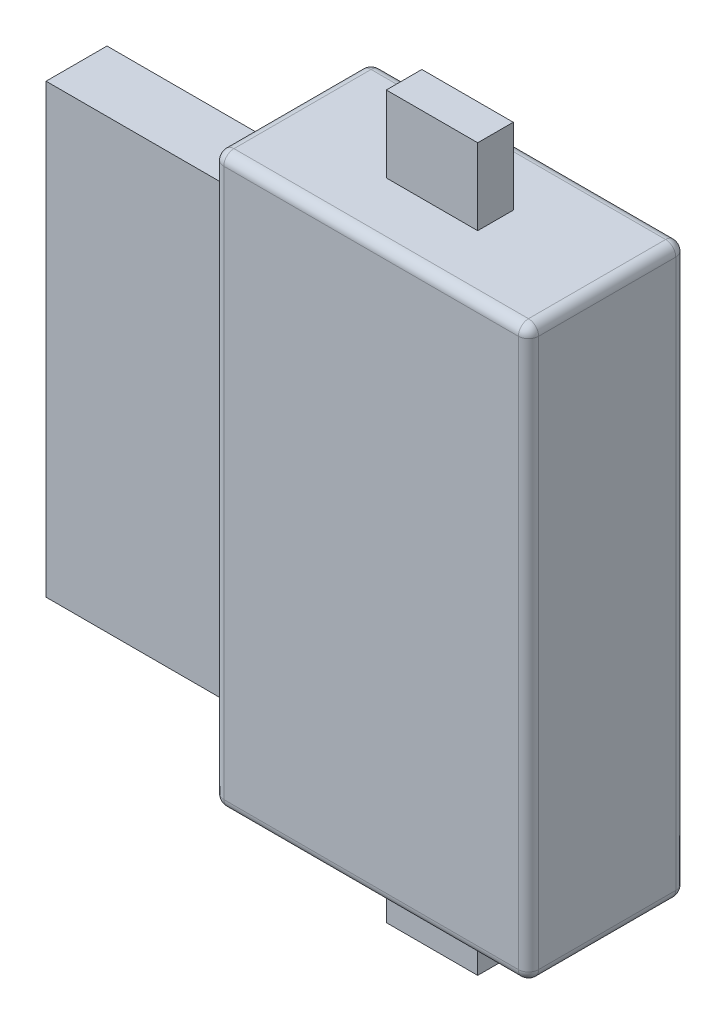
ISO-10303-21;
HEADER;
FILE_DESCRIPTION(('STEP AP214'),'2;1');
FILE_NAME('part.step','',(''),(''),'','','');
FILE_SCHEMA(('AUTOMOTIVE_DESIGN { 1 0 10303 214 1 1 1 1 }'));
ENDSEC;
DATA;
#1=APPLICATION_CONTEXT('core data for automotive mechanical design processes');
#2=APPLICATION_PROTOCOL_DEFINITION('international standard','automotive_design',2000,#1);
#3=PRODUCT_CONTEXT('',#1,'mechanical');
#4=PRODUCT('Part','Part','',(#3));
#5=PRODUCT_RELATED_PRODUCT_CATEGORY('part','',(#4));
#6=PRODUCT_DEFINITION_FORMATION('','',#4);
#7=PRODUCT_DEFINITION_CONTEXT('part definition',#1,'design');
#8=PRODUCT_DEFINITION('design','',#6,#7);
#9=PRODUCT_DEFINITION_SHAPE('','',#8);
#10=(LENGTH_UNIT() NAMED_UNIT(*) SI_UNIT(.MILLI.,.METRE.));
#11=(NAMED_UNIT(*) PLANE_ANGLE_UNIT() SI_UNIT($,.RADIAN.));
#12=(NAMED_UNIT(*) SI_UNIT($,.STERADIAN.) SOLID_ANGLE_UNIT());
#13=UNCERTAINTY_MEASURE_WITH_UNIT(LENGTH_MEASURE(1.E-05),#10,'distance_accuracy_value','');
#14=(GEOMETRIC_REPRESENTATION_CONTEXT(3) GLOBAL_UNCERTAINTY_ASSIGNED_CONTEXT((#13)) GLOBAL_UNIT_ASSIGNED_CONTEXT((#10,
#11,#12)) REPRESENTATION_CONTEXT('',''));
#15=CARTESIAN_POINT('',(0.,0.,0.));
#16=DIRECTION('',(0.,0.,1.));
#17=DIRECTION('',(1.,0.,0.));
#18=AXIS2_PLACEMENT_3D('',#15,#16,#17);
#19=CARTESIAN_POINT('',(31.,-15.,15.5));
#20=DIRECTION('',(0.,1.,0.));
#21=DIRECTION('',(0.,0.,1.));
#22=AXIS2_PLACEMENT_3D('',#19,#20,#21);
#23=PLANE('',#22);
#24=DIRECTION('',(1.,0.,0.));
#25=VECTOR('',#24,1.);
#26=CARTESIAN_POINT('',(22.,-15.,19.));
#27=LINE('',#26,#25);
#28=CARTESIAN_POINT('',(22.,-15.,19.));
#29=VERTEX_POINT('',#28);
#30=CARTESIAN_POINT('',(40.,-15.,19.));
#31=VERTEX_POINT('',#30);
#32=EDGE_CURVE('E450',#29,#31,#27,.T.);
#33=ORIENTED_EDGE('',*,*,#32,.F.);
#34=DIRECTION('',(0.,0.,1.));
#35=VECTOR('',#34,1.);
#36=CARTESIAN_POINT('',(22.,-15.,12.));
#37=LINE('',#36,#35);
#38=CARTESIAN_POINT('',(22.,-15.,12.));
#39=VERTEX_POINT('',#38);
#40=EDGE_CURVE('E547',#39,#29,#37,.T.);
#41=ORIENTED_EDGE('',*,*,#40,.F.);
#42=DIRECTION('',(-1.,0.,0.));
#43=VECTOR('',#42,1.);
#44=CARTESIAN_POINT('',(40.,-15.,12.));
#45=LINE('',#44,#43);
#46=CARTESIAN_POINT('',(40.,-15.,12.));
#47=VERTEX_POINT('',#46);
#48=EDGE_CURVE('E213',#47,#39,#45,.T.);
#49=ORIENTED_EDGE('',*,*,#48,.F.);
#50=DIRECTION('',(0.,0.,-1.));
#51=VECTOR('',#50,1.);
#52=CARTESIAN_POINT('',(40.,-15.,19.));
#53=LINE('',#52,#51);
#54=EDGE_CURVE('E210',#31,#47,#53,.T.);
#55=ORIENTED_EDGE('',*,*,#54,.F.);
#56=EDGE_LOOP('',(#33,#41,#49,#55));
#57=FACE_BOUND('',#56,.T.);
#58=ADVANCED_FACE('F17',(#57),#23,.F.);
#59=CARTESIAN_POINT('',(60.,2.,2.));
#60=DIRECTION('',(1.,0.,0.));
#61=DIRECTION('',(0.,1.,0.));
#62=AXIS2_PLACEMENT_3D('',#59,#60,#61);
#63=SPHERICAL_SURFACE('',#62,2.);
#64=CARTESIAN_POINT('',(60.,2.,2.));
#65=DIRECTION('',(1.,0.,0.));
#66=DIRECTION('',(0.,0.,-1.));
#67=AXIS2_PLACEMENT_3D('',#64,#65,#66);
#68=CIRCLE('',#67,2.);
#69=CARTESIAN_POINT('',(60.,2.,0.));
#70=VERTEX_POINT('',#69);
#71=CARTESIAN_POINT('',(60.,0.,2.));
#72=VERTEX_POINT('',#71);
#73=EDGE_CURVE('E182',#70,#72,#68,.F.);
#74=ORIENTED_EDGE('',*,*,#73,.F.);
#75=CARTESIAN_POINT('',(60.,1.99999999999999,2.));
#76=DIRECTION('',(0.,1.,0.));
#77=DIRECTION('',(-1.,0.,0.));
#78=AXIS2_PLACEMENT_3D('',#75,#76,#77);
#79=CIRCLE('',#78,2.);
#80=CARTESIAN_POINT('',(62.,2.,2.));
#81=VERTEX_POINT('',#80);
#82=EDGE_CURVE('E185',#81,#70,#79,.T.);
#83=ORIENTED_EDGE('',*,*,#82,.F.);
#84=CARTESIAN_POINT('',(60.,1.99999999999999,2.));
#85=DIRECTION('',(0.,0.,1.));
#86=DIRECTION('',(1.,0.,0.));
#87=AXIS2_PLACEMENT_3D('',#84,#85,#86);
#88=CIRCLE('',#87,2.);
#89=EDGE_CURVE('E188',#72,#81,#88,.T.);
#90=ORIENTED_EDGE('',*,*,#89,.F.);
#91=EDGE_LOOP('',(#74,#83,#90));
#92=FACE_BOUND('',#91,.T.);
#93=ADVANCED_FACE('F184',(#92),#63,.T.);
#94=CARTESIAN_POINT('',(60.,110.,2.));
#95=DIRECTION('',(1.,0.,0.));
#96=DIRECTION('',(0.,1.,0.));
#97=AXIS2_PLACEMENT_3D('',#94,#95,#96);
#98=SPHERICAL_SURFACE('',#97,2.);
#99=CARTESIAN_POINT('',(60.,110.,2.));
#100=DIRECTION('',(0.,1.,0.));
#101=DIRECTION('',(-1.,0.,0.));
#102=AXIS2_PLACEMENT_3D('',#99,#100,#101);
#103=CIRCLE('',#102,2.);
#104=CARTESIAN_POINT('',(60.,110.,0.));
#105=VERTEX_POINT('',#104);
#106=CARTESIAN_POINT('',(62.,110.,2.));
#107=VERTEX_POINT('',#106);
#108=EDGE_CURVE('E201',#105,#107,#103,.F.);
#109=ORIENTED_EDGE('',*,*,#108,.F.);
#110=CARTESIAN_POINT('',(60.,110.,2.));
#111=DIRECTION('',(-1.,0.,0.));
#112=DIRECTION('',(0.,0.,1.));
#113=AXIS2_PLACEMENT_3D('',#110,#111,#112);
#114=CIRCLE('',#113,2.);
#115=CARTESIAN_POINT('',(60.,112.,2.));
#116=VERTEX_POINT('',#115);
#117=EDGE_CURVE('E534',#116,#105,#114,.T.);
#118=ORIENTED_EDGE('',*,*,#117,.F.);
#119=CARTESIAN_POINT('',(60.,110.,2.));
#120=DIRECTION('',(0.,0.,1.));
#121=DIRECTION('',(1.,0.,0.));
#122=AXIS2_PLACEMENT_3D('',#119,#120,#121);
#123=CIRCLE('',#122,2.);
#124=EDGE_CURVE('E530',#107,#116,#123,.T.);
#125=ORIENTED_EDGE('',*,*,#124,.F.);
#126=EDGE_LOOP('',(#109,#118,#125));
#127=FACE_BOUND('',#126,.T.);
#128=ADVANCED_FACE('F241',(#127),#98,.T.);
#129=CARTESIAN_POINT('',(31.,127.,15.5));
#130=DIRECTION('',(0.,1.,0.));
#131=DIRECTION('',(0.,0.,1.));
#132=AXIS2_PLACEMENT_3D('',#129,#130,#131);
#133=PLANE('',#132);
#134=DIRECTION('',(0.,0.,1.));
#135=VECTOR('',#134,1.);
#136=CARTESIAN_POINT('',(22.,127.,19.));
#137=LINE('',#136,#135);
#138=CARTESIAN_POINT('',(22.,127.,19.));
#139=VERTEX_POINT('',#138);
#140=CARTESIAN_POINT('',(22.,127.,12.));
#141=VERTEX_POINT('',#140);
#142=EDGE_CURVE('E518',#139,#141,#137,.F.);
#143=ORIENTED_EDGE('',*,*,#142,.F.);
#144=DIRECTION('',(1.,0.,0.));
#145=VECTOR('',#144,1.);
#146=CARTESIAN_POINT('',(40.,127.,19.));
#147=LINE('',#146,#145);
#148=CARTESIAN_POINT('',(40.,127.,19.));
#149=VERTEX_POINT('',#148);
#150=EDGE_CURVE('E524',#149,#139,#147,.F.);
#151=ORIENTED_EDGE('',*,*,#150,.F.);
#152=DIRECTION('',(0.,0.,-1.));
#153=VECTOR('',#152,1.);
#154=CARTESIAN_POINT('',(40.,127.,12.));
#155=LINE('',#154,#153);
#156=CARTESIAN_POINT('',(40.,127.,12.));
#157=VERTEX_POINT('',#156);
#158=EDGE_CURVE('E527',#157,#149,#155,.F.);
#159=ORIENTED_EDGE('',*,*,#158,.F.);
#160=DIRECTION('',(-1.,0.,0.));
#161=VECTOR('',#160,1.);
#162=CARTESIAN_POINT('',(22.,127.,12.));
#163=LINE('',#162,#161);
#164=EDGE_CURVE('E512',#141,#157,#163,.F.);
#165=ORIENTED_EDGE('',*,*,#164,.F.);
#166=EDGE_LOOP('',(#143,#151,#159,#165));
#167=FACE_BOUND('',#166,.T.);
#168=ADVANCED_FACE('F237',(#167),#133,.T.);
#169=CARTESIAN_POINT('',(1.99999999999997,110.,2.));
#170=DIRECTION('',(1.,0.,0.));
#171=DIRECTION('',(0.,1.,0.));
#172=AXIS2_PLACEMENT_3D('',#169,#170,#171);
#173=SPHERICAL_SURFACE('',#172,2.);
#174=CARTESIAN_POINT('',(1.99999999999997,110.,2.));
#175=DIRECTION('',(0.,-1.,0.));
#176=DIRECTION('',(1.,0.,0.));
#177=AXIS2_PLACEMENT_3D('',#174,#175,#176);
#178=CIRCLE('',#177,2.);
#179=CARTESIAN_POINT('',(0.,110.,2.));
#180=VERTEX_POINT('',#179);
#181=CARTESIAN_POINT('',(1.99999999999997,110.,0.));
#182=VERTEX_POINT('',#181);
#183=EDGE_CURVE('E497',#180,#182,#178,.T.);
#184=ORIENTED_EDGE('',*,*,#183,.F.);
#185=CARTESIAN_POINT('',(1.99999999999997,110.,2.));
#186=DIRECTION('',(0.,0.,1.));
#187=DIRECTION('',(1.,0.,0.));
#188=AXIS2_PLACEMENT_3D('',#185,#186,#187);
#189=CIRCLE('',#188,2.);
#190=CARTESIAN_POINT('',(1.99999999999997,112.,2.));
#191=VERTEX_POINT('',#190);
#192=EDGE_CURVE('E503',#191,#180,#189,.T.);
#193=ORIENTED_EDGE('',*,*,#192,.F.);
#194=CARTESIAN_POINT('',(1.99999999999997,110.,2.));
#195=DIRECTION('',(-1.,0.,0.));
#196=DIRECTION('',(0.,0.,1.));
#197=AXIS2_PLACEMENT_3D('',#194,#195,#196);
#198=CIRCLE('',#197,2.);
#199=EDGE_CURVE('E537',#182,#191,#198,.F.);
#200=ORIENTED_EDGE('',*,*,#199,.F.);
#201=EDGE_LOOP('',(#184,#193,#200));
#202=FACE_BOUND('',#201,.T.);
#203=ADVANCED_FACE('F234',(#202),#173,.T.);
#204=CARTESIAN_POINT('',(31.,56.,0.));
#205=DIRECTION('',(0.,0.,1.));
#206=DIRECTION('',(1.,0.,0.));
#207=AXIS2_PLACEMENT_3D('',#204,#205,#206);
#208=PLANE('',#207);
#209=DIRECTION('',(0.,-1.,0.));
#210=VECTOR('',#209,1.);
#211=CARTESIAN_POINT('',(1.99999999999999,28.,0.));
#212=LINE('',#211,#210);
#213=CARTESIAN_POINT('',(2.,1.99999999998467,0.));
#214=VERTEX_POINT('',#213);
#215=EDGE_CURVE('E495',#182,#214,#212,.T.);
#216=ORIENTED_EDGE('',*,*,#215,.F.);
#217=DIRECTION('',(-1.,0.,0.));
#218=VECTOR('',#217,1.);
#219=CARTESIAN_POINT('',(15.5,110.,0.));
#220=LINE('',#219,#218);
#221=EDGE_CURVE('E206',#105,#182,#220,.T.);
#222=ORIENTED_EDGE('',*,*,#221,.F.);
#223=DIRECTION('',(0.,1.,0.));
#224=VECTOR('',#223,1.);
#225=CARTESIAN_POINT('',(60.,84.,0.));
#226=LINE('',#225,#224);
#227=EDGE_CURVE('E198',#70,#105,#226,.T.);
#228=ORIENTED_EDGE('',*,*,#227,.F.);
#229=DIRECTION('',(1.,0.,0.));
#230=VECTOR('',#229,1.);
#231=CARTESIAN_POINT('',(46.5,2.,0.));
#232=LINE('',#231,#230);
#233=EDGE_CURVE('E177',#214,#70,#232,.T.);
#234=ORIENTED_EDGE('',*,*,#233,.F.);
#235=EDGE_LOOP('',(#216,#222,#228,#234));
#236=FACE_BOUND('',#235,.T.);
#237=ADVANCED_FACE('F204',(#236),#208,.F.);
#238=CARTESIAN_POINT('',(-40.,56.,18.));
#239=DIRECTION('',(1.,0.,0.));
#240=DIRECTION('',(0.,0.,-1.));
#241=AXIS2_PLACEMENT_3D('',#238,#239,#240);
#242=PLANE('',#241);
#243=DIRECTION('',(0.,0.,1.));
#244=VECTOR('',#243,1.);
#245=CARTESIAN_POINT('',(-40.,100.,12.));
#246=LINE('',#245,#244);
#247=CARTESIAN_POINT('',(-40.,100.,12.));
#248=VERTEX_POINT('',#247);
#249=CARTESIAN_POINT('',(-40.,100.,24.));
#250=VERTEX_POINT('',#249);
#251=EDGE_CURVE('E477',#248,#250,#246,.T.);
#252=ORIENTED_EDGE('',*,*,#251,.F.);
#253=DIRECTION('',(0.,1.,0.));
#254=VECTOR('',#253,1.);
#255=CARTESIAN_POINT('',(-40.,12.,12.));
#256=LINE('',#255,#254);
#257=CARTESIAN_POINT('',(-40.,12.,12.));
#258=VERTEX_POINT('',#257);
#259=EDGE_CURVE('E483',#258,#248,#256,.T.);
#260=ORIENTED_EDGE('',*,*,#259,.F.);
#261=DIRECTION('',(0.,0.,-1.));
#262=VECTOR('',#261,1.);
#263=CARTESIAN_POINT('',(-40.,12.,24.));
#264=LINE('',#263,#262);
#265=CARTESIAN_POINT('',(-40.,12.,24.));
#266=VERTEX_POINT('',#265);
#267=EDGE_CURVE('E489',#266,#258,#264,.T.);
#268=ORIENTED_EDGE('',*,*,#267,.F.);
#269=DIRECTION('',(0.,1.,0.));
#270=VECTOR('',#269,1.);
#271=CARTESIAN_POINT('',(-40.,100.,24.));
#272=LINE('',#271,#270);
#273=EDGE_CURVE('E492',#250,#266,#272,.F.);
#274=ORIENTED_EDGE('',*,*,#273,.F.);
#275=EDGE_LOOP('',(#252,#260,#268,#274));
#276=FACE_BOUND('',#275,.T.);
#277=ADVANCED_FACE('F226',(#276),#242,.F.);
#278=CARTESIAN_POINT('',(2.,2.,2.));
#279=DIRECTION('',(1.,0.,0.));
#280=DIRECTION('',(0.,1.,0.));
#281=AXIS2_PLACEMENT_3D('',#278,#279,#280);
#282=SPHERICAL_SURFACE('',#281,2.);
#283=CARTESIAN_POINT('',(2.,2.,2.));
#284=DIRECTION('',(0.,0.,1.));
#285=DIRECTION('',(1.,0.,0.));
#286=AXIS2_PLACEMENT_3D('',#283,#284,#285);
#287=CIRCLE('',#286,2.);
#288=CARTESIAN_POINT('',(0.,2.,2.));
#289=VERTEX_POINT('',#288);
#290=CARTESIAN_POINT('',(2.,0.,2.));
#291=VERTEX_POINT('',#290);
#292=EDGE_CURVE('E468',#289,#291,#287,.T.);
#293=ORIENTED_EDGE('',*,*,#292,.F.);
#294=CARTESIAN_POINT('',(2.,2.,2.));
#295=DIRECTION('',(0.,-1.,0.));
#296=DIRECTION('',(1.,0.,0.));
#297=AXIS2_PLACEMENT_3D('',#294,#295,#296);
#298=CIRCLE('',#297,2.);
#299=EDGE_CURVE('E500',#214,#289,#298,.F.);
#300=ORIENTED_EDGE('',*,*,#299,.F.);
#301=CARTESIAN_POINT('',(2.,2.,2.));
#302=DIRECTION('',(1.,0.,0.));
#303=DIRECTION('',(0.,0.,-1.));
#304=AXIS2_PLACEMENT_3D('',#301,#302,#303);
#305=CIRCLE('',#304,2.);
#306=EDGE_CURVE('E192',#291,#214,#305,.T.);
#307=ORIENTED_EDGE('',*,*,#306,.F.);
#308=EDGE_LOOP('',(#293,#300,#307));
#309=FACE_BOUND('',#308,.T.);
#310=ADVANCED_FACE('F222',(#309),#282,.T.);
#311=CARTESIAN_POINT('',(46.5,2.,2.));
#312=DIRECTION('',(1.,0.,0.));
#313=DIRECTION('',(0.,0.,-1.));
#314=AXIS2_PLACEMENT_3D('',#311,#312,#313);
#315=CYLINDRICAL_SURFACE('',#314,2.);
#316=ORIENTED_EDGE('',*,*,#306,.T.);
#317=ORIENTED_EDGE('',*,*,#233,.T.);
#318=ORIENTED_EDGE('',*,*,#73,.T.);
#319=DIRECTION('',(1.,0.,0.));
#320=VECTOR('',#319,1.);
#321=CARTESIAN_POINT('',(62.,0.,2.));
#322=LINE('',#321,#320);
#323=EDGE_CURVE('E462',#291,#72,#322,.T.);
#324=ORIENTED_EDGE('',*,*,#323,.F.);
#325=EDGE_LOOP('',(#316,#317,#318,#324));
#326=FACE_BOUND('',#325,.T.);
#327=ADVANCED_FACE('F209',(#326),#315,.T.);
#328=CARTESIAN_POINT('',(40.,0.,19.));
#329=DIRECTION('',(1.,0.,0.));
#330=DIRECTION('',(0.,0.,-1.));
#331=AXIS2_PLACEMENT_3D('',#328,#329,#330);
#332=PLANE('',#331);
#333=DIRECTION('',(0.,0.,-1.));
#334=VECTOR('',#333,1.);
#335=CARTESIAN_POINT('',(40.,0.,0.));
#336=LINE('',#335,#334);
#337=CARTESIAN_POINT('',(40.,0.,19.));
#338=VERTEX_POINT('',#337);
#339=CARTESIAN_POINT('',(40.,0.,12.));
#340=VERTEX_POINT('',#339);
#341=EDGE_CURVE('E434',#338,#340,#336,.T.);
#342=ORIENTED_EDGE('',*,*,#341,.F.);
#343=DIRECTION('',(0.,1.,0.));
#344=VECTOR('',#343,1.);
#345=CARTESIAN_POINT('',(40.,0.,19.));
#346=LINE('',#345,#344);
#347=EDGE_CURVE('E436',#31,#338,#346,.T.);
#348=ORIENTED_EDGE('',*,*,#347,.F.);
#349=ORIENTED_EDGE('',*,*,#54,.T.);
#350=DIRECTION('',(0.,1.,0.));
#351=VECTOR('',#350,1.);
#352=CARTESIAN_POINT('',(40.,0.,12.));
#353=LINE('',#352,#351);
#354=EDGE_CURVE('E439',#340,#47,#353,.F.);
#355=ORIENTED_EDGE('',*,*,#354,.F.);
#356=EDGE_LOOP('',(#342,#348,#349,#355));
#357=FACE_BOUND('',#356,.T.);
#358=ADVANCED_FACE('F425',(#357),#332,.T.);
#359=CARTESIAN_POINT('',(40.,0.,12.));
#360=DIRECTION('',(0.,0.,-1.));
#361=DIRECTION('',(-1.,0.,0.));
#362=AXIS2_PLACEMENT_3D('',#359,#360,#361);
#363=PLANE('',#362);
#364=DIRECTION('',(1.,0.,0.));
#365=VECTOR('',#364,1.);
#366=CARTESIAN_POINT('',(62.,0.,12.));
#367=LINE('',#366,#365);
#368=CARTESIAN_POINT('',(22.,0.,12.));
#369=VERTEX_POINT('',#368);
#370=EDGE_CURVE('E443',#340,#369,#367,.F.);
#371=ORIENTED_EDGE('',*,*,#370,.F.);
#372=ORIENTED_EDGE('',*,*,#354,.T.);
#373=ORIENTED_EDGE('',*,*,#48,.T.);
#374=DIRECTION('',(0.,1.,0.));
#375=VECTOR('',#374,1.);
#376=CARTESIAN_POINT('',(22.,0.,12.));
#377=LINE('',#376,#375);
#378=EDGE_CURVE('E544',#369,#39,#377,.F.);
#379=ORIENTED_EDGE('',*,*,#378,.F.);
#380=EDGE_LOOP('',(#371,#372,#373,#379));
#381=FACE_BOUND('',#380,.T.);
#382=ADVANCED_FACE('F422',(#381),#363,.T.);
#383=CARTESIAN_POINT('',(22.,0.,12.));
#384=DIRECTION('',(-1.,0.,0.));
#385=DIRECTION('',(0.,0.,1.));
#386=AXIS2_PLACEMENT_3D('',#383,#384,#385);
#387=PLANE('',#386);
#388=DIRECTION('',(0.,0.,-1.));
#389=VECTOR('',#388,1.);
#390=CARTESIAN_POINT('',(22.,0.,0.));
#391=LINE('',#390,#389);
#392=CARTESIAN_POINT('',(22.,0.,19.));
#393=VERTEX_POINT('',#392);
#394=EDGE_CURVE('E455',#369,#393,#391,.F.);
#395=ORIENTED_EDGE('',*,*,#394,.F.);
#396=ORIENTED_EDGE('',*,*,#378,.T.);
#397=ORIENTED_EDGE('',*,*,#40,.T.);
#398=DIRECTION('',(0.,1.,0.));
#399=VECTOR('',#398,1.);
#400=CARTESIAN_POINT('',(22.,0.,19.));
#401=LINE('',#400,#399);
#402=EDGE_CURVE('E451',#393,#29,#401,.F.);
#403=ORIENTED_EDGE('',*,*,#402,.F.);
#404=EDGE_LOOP('',(#395,#396,#397,#403));
#405=FACE_BOUND('',#404,.T.);
#406=ADVANCED_FACE('F418',(#405),#387,.T.);
#407=CARTESIAN_POINT('',(22.,0.,19.));
#408=DIRECTION('',(0.,0.,1.));
#409=DIRECTION('',(1.,0.,0.));
#410=AXIS2_PLACEMENT_3D('',#407,#408,#409);
#411=PLANE('',#410);
#412=DIRECTION('',(1.,0.,0.));
#413=VECTOR('',#412,1.);
#414=CARTESIAN_POINT('',(62.,0.,19.));
#415=LINE('',#414,#413);
#416=EDGE_CURVE('E448',#393,#338,#415,.T.);
#417=ORIENTED_EDGE('',*,*,#416,.F.);
#418=ORIENTED_EDGE('',*,*,#402,.T.);
#419=ORIENTED_EDGE('',*,*,#32,.T.);
#420=ORIENTED_EDGE('',*,*,#347,.T.);
#421=EDGE_LOOP('',(#417,#418,#419,#420));
#422=FACE_BOUND('',#421,.T.);
#423=ADVANCED_FACE('F415',(#422),#411,.T.);
#424=CARTESIAN_POINT('',(60.,84.,2.));
#425=DIRECTION('',(0.,1.,0.));
#426=DIRECTION('',(-1.,0.,0.));
#427=AXIS2_PLACEMENT_3D('',#424,#425,#426);
#428=CYLINDRICAL_SURFACE('',#427,2.);
#429=ORIENTED_EDGE('',*,*,#82,.T.);
#430=ORIENTED_EDGE('',*,*,#227,.T.);
#431=ORIENTED_EDGE('',*,*,#108,.T.);
#432=DIRECTION('',(0.,1.,0.));
#433=VECTOR('',#432,1.);
#434=CARTESIAN_POINT('',(62.,112.,2.));
#435=LINE('',#434,#433);
#436=EDGE_CURVE('E200',#81,#107,#435,.T.);
#437=ORIENTED_EDGE('',*,*,#436,.F.);
#438=EDGE_LOOP('',(#429,#430,#431,#437));
#439=FACE_BOUND('',#438,.T.);
#440=ADVANCED_FACE('F196',(#439),#428,.T.);
#441=CARTESIAN_POINT('',(60.,1.99999999999999,0.));
#442=DIRECTION('',(0.,0.,1.));
#443=DIRECTION('',(1.,0.,0.));
#444=AXIS2_PLACEMENT_3D('',#441,#442,#443);
#445=CYLINDRICAL_SURFACE('',#444,2.);
#446=ORIENTED_EDGE('',*,*,#89,.T.);
#447=DIRECTION('',(0.,0.,-1.));
#448=VECTOR('',#447,1.);
#449=CARTESIAN_POINT('',(62.,1.99999999999999,0.));
#450=LINE('',#449,#448);
#451=CARTESIAN_POINT('',(62.,1.99999999999999,29.));
#452=VERTEX_POINT('',#451);
#453=EDGE_CURVE('E338',#452,#81,#450,.T.);
#454=ORIENTED_EDGE('',*,*,#453,.F.);
#455=CARTESIAN_POINT('',(60.,1.99999999999999,29.));
#456=DIRECTION('',(0.,0.,-1.));
#457=DIRECTION('',(1.,0.,0.));
#458=AXIS2_PLACEMENT_3D('',#455,#456,#457);
#459=CIRCLE('',#458,2.);
#460=CARTESIAN_POINT('',(60.,0.,29.));
#461=VERTEX_POINT('',#460);
#462=EDGE_CURVE('E345',#461,#452,#459,.F.);
#463=ORIENTED_EDGE('',*,*,#462,.F.);
#464=DIRECTION('',(0.,0.,-1.));
#465=VECTOR('',#464,1.);
#466=CARTESIAN_POINT('',(60.,0.,0.));
#467=LINE('',#466,#465);
#468=EDGE_CURVE('E444',#72,#461,#467,.F.);
#469=ORIENTED_EDGE('',*,*,#468,.F.);
#470=EDGE_LOOP('',(#446,#454,#463,#469));
#471=FACE_BOUND('',#470,.T.);
#472=ADVANCED_FACE('F408',(#471),#445,.T.);
#473=CARTESIAN_POINT('',(15.5,110.,2.));
#474=DIRECTION('',(-1.,0.,0.));
#475=DIRECTION('',(0.,0.,1.));
#476=AXIS2_PLACEMENT_3D('',#473,#474,#475);
#477=CYLINDRICAL_SURFACE('',#476,2.);
#478=ORIENTED_EDGE('',*,*,#117,.T.);
#479=ORIENTED_EDGE('',*,*,#221,.T.);
#480=ORIENTED_EDGE('',*,*,#199,.T.);
#481=DIRECTION('',(1.,0.,0.));
#482=VECTOR('',#481,1.);
#483=CARTESIAN_POINT('',(0.,112.,2.));
#484=LINE('',#483,#482);
#485=EDGE_CURVE('E333',#116,#191,#484,.F.);
#486=ORIENTED_EDGE('',*,*,#485,.F.);
#487=EDGE_LOOP('',(#478,#479,#480,#486));
#488=FACE_BOUND('',#487,.T.);
#489=ADVANCED_FACE('F404',(#488),#477,.T.);
#490=CARTESIAN_POINT('',(60.,110.,0.));
#491=DIRECTION('',(0.,0.,1.));
#492=DIRECTION('',(1.,0.,0.));
#493=AXIS2_PLACEMENT_3D('',#490,#491,#492);
#494=CYLINDRICAL_SURFACE('',#493,2.);
#495=ORIENTED_EDGE('',*,*,#124,.T.);
#496=DIRECTION('',(0.,0.,1.));
#497=VECTOR('',#496,1.);
#498=CARTESIAN_POINT('',(60.,112.,0.));
#499=LINE('',#498,#497);
#500=CARTESIAN_POINT('',(60.,112.,29.));
#501=VERTEX_POINT('',#500);
#502=EDGE_CURVE('E612',#501,#116,#499,.F.);
#503=ORIENTED_EDGE('',*,*,#502,.F.);
#504=CARTESIAN_POINT('',(60.,110.,29.));
#505=DIRECTION('',(0.,0.,1.));
#506=DIRECTION('',(1.,0.,0.));
#507=AXIS2_PLACEMENT_3D('',#504,#505,#506);
#508=CIRCLE('',#507,2.);
#509=CARTESIAN_POINT('',(62.,110.,29.));
#510=VERTEX_POINT('',#509);
#511=EDGE_CURVE('E335',#510,#501,#508,.T.);
#512=ORIENTED_EDGE('',*,*,#511,.F.);
#513=DIRECTION('',(0.,0.,-1.));
#514=VECTOR('',#513,1.);
#515=CARTESIAN_POINT('',(62.,110.,0.));
#516=LINE('',#515,#514);
#517=EDGE_CURVE('E341',#107,#510,#516,.F.);
#518=ORIENTED_EDGE('',*,*,#517,.F.);
#519=EDGE_LOOP('',(#495,#503,#512,#518));
#520=FACE_BOUND('',#519,.T.);
#521=ADVANCED_FACE('F400',(#520),#494,.T.);
#522=CARTESIAN_POINT('',(40.,112.,12.));
#523=DIRECTION('',(1.,0.,0.));
#524=DIRECTION('',(0.,0.,-1.));
#525=AXIS2_PLACEMENT_3D('',#522,#523,#524);
#526=PLANE('',#525);
#527=DIRECTION('',(0.,0.,1.));
#528=VECTOR('',#527,1.);
#529=CARTESIAN_POINT('',(40.,112.,0.));
#530=LINE('',#529,#528);
#531=CARTESIAN_POINT('',(40.,112.,12.));
#532=VERTEX_POINT('',#531);
#533=CARTESIAN_POINT('',(40.,112.,19.));
#534=VERTEX_POINT('',#533);
#535=EDGE_CURVE('E613',#532,#534,#530,.T.);
#536=ORIENTED_EDGE('',*,*,#535,.F.);
#537=DIRECTION('',(0.,1.,0.));
#538=VECTOR('',#537,1.);
#539=CARTESIAN_POINT('',(40.,112.,12.));
#540=LINE('',#539,#538);
#541=EDGE_CURVE('E509',#157,#532,#540,.F.);
#542=ORIENTED_EDGE('',*,*,#541,.F.);
#543=ORIENTED_EDGE('',*,*,#158,.T.);
#544=DIRECTION('',(0.,1.,0.));
#545=VECTOR('',#544,1.);
#546=CARTESIAN_POINT('',(40.,112.,19.));
#547=LINE('',#546,#545);
#548=EDGE_CURVE('E521',#534,#149,#547,.T.);
#549=ORIENTED_EDGE('',*,*,#548,.F.);
#550=EDGE_LOOP('',(#536,#542,#543,#549));
#551=FACE_BOUND('',#550,.T.);
#552=ADVANCED_FACE('F396',(#551),#526,.T.);
#553=CARTESIAN_POINT('',(40.,112.,19.));
#554=DIRECTION('',(0.,0.,1.));
#555=DIRECTION('',(1.,0.,0.));
#556=AXIS2_PLACEMENT_3D('',#553,#554,#555);
#557=PLANE('',#556);
#558=DIRECTION('',(1.,0.,0.));
#559=VECTOR('',#558,1.);
#560=CARTESIAN_POINT('',(0.,112.,19.));
#561=LINE('',#560,#559);
#562=CARTESIAN_POINT('',(22.,112.,19.));
#563=VERTEX_POINT('',#562);
#564=EDGE_CURVE('E618',#534,#563,#561,.F.);
#565=ORIENTED_EDGE('',*,*,#564,.F.);
#566=ORIENTED_EDGE('',*,*,#548,.T.);
#567=ORIENTED_EDGE('',*,*,#150,.T.);
#568=DIRECTION('',(0.,1.,0.));
#569=VECTOR('',#568,1.);
#570=CARTESIAN_POINT('',(22.,112.,19.));
#571=LINE('',#570,#569);
#572=EDGE_CURVE('E515',#563,#139,#571,.T.);
#573=ORIENTED_EDGE('',*,*,#572,.F.);
#574=EDGE_LOOP('',(#565,#566,#567,#573));
#575=FACE_BOUND('',#574,.T.);
#576=ADVANCED_FACE('F392',(#575),#557,.T.);
#577=CARTESIAN_POINT('',(22.,112.,19.));
#578=DIRECTION('',(-1.,0.,0.));
#579=DIRECTION('',(0.,0.,1.));
#580=AXIS2_PLACEMENT_3D('',#577,#578,#579);
#581=PLANE('',#580);
#582=DIRECTION('',(0.,0.,1.));
#583=VECTOR('',#582,1.);
#584=CARTESIAN_POINT('',(22.,112.,0.));
#585=LINE('',#584,#583);
#586=CARTESIAN_POINT('',(22.,112.,12.));
#587=VERTEX_POINT('',#586);
#588=EDGE_CURVE('E621',#563,#587,#585,.F.);
#589=ORIENTED_EDGE('',*,*,#588,.F.);
#590=ORIENTED_EDGE('',*,*,#572,.T.);
#591=ORIENTED_EDGE('',*,*,#142,.T.);
#592=DIRECTION('',(0.,1.,0.));
#593=VECTOR('',#592,1.);
#594=CARTESIAN_POINT('',(22.,112.,12.));
#595=LINE('',#594,#593);
#596=EDGE_CURVE('E506',#587,#141,#595,.T.);
#597=ORIENTED_EDGE('',*,*,#596,.F.);
#598=EDGE_LOOP('',(#589,#590,#591,#597));
#599=FACE_BOUND('',#598,.T.);
#600=ADVANCED_FACE('F388',(#599),#581,.T.);
#601=CARTESIAN_POINT('',(22.,112.,12.));
#602=DIRECTION('',(0.,0.,-1.));
#603=DIRECTION('',(-1.,0.,0.));
#604=AXIS2_PLACEMENT_3D('',#601,#602,#603);
#605=PLANE('',#604);
#606=DIRECTION('',(1.,0.,0.));
#607=VECTOR('',#606,1.);
#608=CARTESIAN_POINT('',(0.,112.,12.));
#609=LINE('',#608,#607);
#610=EDGE_CURVE('E623',#587,#532,#609,.T.);
#611=ORIENTED_EDGE('',*,*,#610,.F.);
#612=ORIENTED_EDGE('',*,*,#596,.T.);
#613=ORIENTED_EDGE('',*,*,#164,.T.);
#614=ORIENTED_EDGE('',*,*,#541,.T.);
#615=EDGE_LOOP('',(#611,#612,#613,#614));
#616=FACE_BOUND('',#615,.T.);
#617=ADVANCED_FACE('F384',(#616),#605,.T.);
#618=CARTESIAN_POINT('',(1.99999999999997,110.,0.));
#619=DIRECTION('',(0.,0.,1.));
#620=DIRECTION('',(1.,0.,0.));
#621=AXIS2_PLACEMENT_3D('',#618,#619,#620);
#622=CYLINDRICAL_SURFACE('',#621,2.);
#623=ORIENTED_EDGE('',*,*,#192,.T.);
#624=DIRECTION('',(0.,0.,1.));
#625=VECTOR('',#624,1.);
#626=CARTESIAN_POINT('',(0.,110.,0.));
#627=LINE('',#626,#625);
#628=CARTESIAN_POINT('',(0.,110.,29.));
#629=VERTEX_POINT('',#628);
#630=EDGE_CURVE('E306',#629,#180,#627,.F.);
#631=ORIENTED_EDGE('',*,*,#630,.F.);
#632=CARTESIAN_POINT('',(1.99999999999997,110.,29.));
#633=DIRECTION('',(0.,0.,1.));
#634=DIRECTION('',(1.,0.,0.));
#635=AXIS2_PLACEMENT_3D('',#632,#633,#634);
#636=CIRCLE('',#635,2.);
#637=CARTESIAN_POINT('',(1.99999999999997,112.,29.));
#638=VERTEX_POINT('',#637);
#639=EDGE_CURVE('E312',#638,#629,#636,.T.);
#640=ORIENTED_EDGE('',*,*,#639,.F.);
#641=DIRECTION('',(0.,0.,1.));
#642=VECTOR('',#641,1.);
#643=CARTESIAN_POINT('',(1.99999999999997,112.,0.));
#644=LINE('',#643,#642);
#645=EDGE_CURVE('E611',#191,#638,#644,.T.);
#646=ORIENTED_EDGE('',*,*,#645,.F.);
#647=EDGE_LOOP('',(#623,#631,#640,#646));
#648=FACE_BOUND('',#647,.T.);
#649=ADVANCED_FACE('F380',(#648),#622,.T.);
#650=CARTESIAN_POINT('',(1.99999999999999,28.,2.));
#651=DIRECTION('',(0.,-1.,0.));
#652=DIRECTION('',(1.,0.,0.));
#653=AXIS2_PLACEMENT_3D('',#650,#651,#652);
#654=CYLINDRICAL_SURFACE('',#653,2.);
#655=ORIENTED_EDGE('',*,*,#183,.T.);
#656=ORIENTED_EDGE('',*,*,#215,.T.);
#657=ORIENTED_EDGE('',*,*,#299,.T.);
#658=DIRECTION('',(0.,1.,0.));
#659=VECTOR('',#658,1.);
#660=CARTESIAN_POINT('',(0.,0.,2.));
#661=LINE('',#660,#659);
#662=EDGE_CURVE('E303',#180,#289,#661,.F.);
#663=ORIENTED_EDGE('',*,*,#662,.F.);
#664=EDGE_LOOP('',(#655,#656,#657,#663));
#665=FACE_BOUND('',#664,.T.);
#666=ADVANCED_FACE('F376',(#665),#654,.T.);
#667=CARTESIAN_POINT('',(0.,100.,24.));
#668=DIRECTION('',(0.,0.,1.));
#669=DIRECTION('',(1.,0.,0.));
#670=AXIS2_PLACEMENT_3D('',#667,#668,#669);
#671=PLANE('',#670);
#672=DIRECTION('',(0.,1.,0.));
#673=VECTOR('',#672,1.);
#674=CARTESIAN_POINT('',(0.,0.,24.));
#675=LINE('',#674,#673);
#676=CARTESIAN_POINT('',(0.,100.,24.));
#677=VERTEX_POINT('',#676);
#678=CARTESIAN_POINT('',(0.,12.,24.));
#679=VERTEX_POINT('',#678);
#680=EDGE_CURVE('E300',#677,#679,#675,.F.);
#681=ORIENTED_EDGE('',*,*,#680,.F.);
#682=DIRECTION('',(1.,0.,0.));
#683=VECTOR('',#682,1.);
#684=CARTESIAN_POINT('',(0.,100.,24.));
#685=LINE('',#684,#683);
#686=EDGE_CURVE('E474',#250,#677,#685,.T.);
#687=ORIENTED_EDGE('',*,*,#686,.F.);
#688=ORIENTED_EDGE('',*,*,#273,.T.);
#689=DIRECTION('',(1.,0.,0.));
#690=VECTOR('',#689,1.);
#691=CARTESIAN_POINT('',(0.,12.,24.));
#692=LINE('',#691,#690);
#693=EDGE_CURVE('E486',#679,#266,#692,.F.);
#694=ORIENTED_EDGE('',*,*,#693,.F.);
#695=EDGE_LOOP('',(#681,#687,#688,#694));
#696=FACE_BOUND('',#695,.T.);
#697=ADVANCED_FACE('F372',(#696),#671,.T.);
#698=CARTESIAN_POINT('',(0.,12.,24.));
#699=DIRECTION('',(0.,-1.,0.));
#700=DIRECTION('',(0.,0.,-1.));
#701=AXIS2_PLACEMENT_3D('',#698,#699,#700);
#702=PLANE('',#701);
#703=DIRECTION('',(0.,0.,1.));
#704=VECTOR('',#703,1.);
#705=CARTESIAN_POINT('',(0.,12.,0.));
#706=LINE('',#705,#704);
#707=CARTESIAN_POINT('',(0.,12.,12.));
#708=VERTEX_POINT('',#707);
#709=EDGE_CURVE('E297',#679,#708,#706,.F.);
#710=ORIENTED_EDGE('',*,*,#709,.F.);
#711=ORIENTED_EDGE('',*,*,#693,.T.);
#712=ORIENTED_EDGE('',*,*,#267,.T.);
#713=DIRECTION('',(-1.,0.,0.));
#714=VECTOR('',#713,1.);
#715=CARTESIAN_POINT('',(0.,12.,12.));
#716=LINE('',#715,#714);
#717=EDGE_CURVE('E480',#708,#258,#716,.T.);
#718=ORIENTED_EDGE('',*,*,#717,.F.);
#719=EDGE_LOOP('',(#710,#711,#712,#718));
#720=FACE_BOUND('',#719,.T.);
#721=ADVANCED_FACE('F368',(#720),#702,.T.);
#722=CARTESIAN_POINT('',(0.,12.,12.));
#723=DIRECTION('',(0.,0.,-1.));
#724=DIRECTION('',(-1.,0.,0.));
#725=AXIS2_PLACEMENT_3D('',#722,#723,#724);
#726=PLANE('',#725);
#727=DIRECTION('',(0.,1.,0.));
#728=VECTOR('',#727,1.);
#729=CARTESIAN_POINT('',(0.,0.,12.));
#730=LINE('',#729,#728);
#731=CARTESIAN_POINT('',(0.,100.,12.));
#732=VERTEX_POINT('',#731);
#733=EDGE_CURVE('E294',#708,#732,#730,.T.);
#734=ORIENTED_EDGE('',*,*,#733,.F.);
#735=ORIENTED_EDGE('',*,*,#717,.T.);
#736=ORIENTED_EDGE('',*,*,#259,.T.);
#737=DIRECTION('',(1.,0.,0.));
#738=VECTOR('',#737,1.);
#739=CARTESIAN_POINT('',(0.,100.,12.));
#740=LINE('',#739,#738);
#741=EDGE_CURVE('E471',#732,#248,#740,.F.);
#742=ORIENTED_EDGE('',*,*,#741,.F.);
#743=EDGE_LOOP('',(#734,#735,#736,#742));
#744=FACE_BOUND('',#743,.T.);
#745=ADVANCED_FACE('F364',(#744),#726,.T.);
#746=CARTESIAN_POINT('',(0.,100.,12.));
#747=DIRECTION('',(0.,1.,0.));
#748=DIRECTION('',(0.,0.,1.));
#749=AXIS2_PLACEMENT_3D('',#746,#747,#748);
#750=PLANE('',#749);
#751=DIRECTION('',(0.,0.,1.));
#752=VECTOR('',#751,1.);
#753=CARTESIAN_POINT('',(0.,100.,0.));
#754=LINE('',#753,#752);
#755=EDGE_CURVE('E291',#732,#677,#754,.T.);
#756=ORIENTED_EDGE('',*,*,#755,.F.);
#757=ORIENTED_EDGE('',*,*,#741,.T.);
#758=ORIENTED_EDGE('',*,*,#251,.T.);
#759=ORIENTED_EDGE('',*,*,#686,.T.);
#760=EDGE_LOOP('',(#756,#757,#758,#759));
#761=FACE_BOUND('',#760,.T.);
#762=ADVANCED_FACE('F360',(#761),#750,.T.);
#763=CARTESIAN_POINT('',(2.,2.,0.));
#764=DIRECTION('',(0.,0.,1.));
#765=DIRECTION('',(1.,0.,0.));
#766=AXIS2_PLACEMENT_3D('',#763,#764,#765);
#767=CYLINDRICAL_SURFACE('',#766,2.);
#768=ORIENTED_EDGE('',*,*,#292,.T.);
#769=DIRECTION('',(0.,0.,-1.));
#770=VECTOR('',#769,1.);
#771=CARTESIAN_POINT('',(2.,0.,0.));
#772=LINE('',#771,#770);
#773=CARTESIAN_POINT('',(2.,0.,28.9999999999755));
#774=VERTEX_POINT('',#773);
#775=EDGE_CURVE('E465',#774,#291,#772,.T.);
#776=ORIENTED_EDGE('',*,*,#775,.F.);
#777=CARTESIAN_POINT('',(2.,2.,29.));
#778=DIRECTION('',(0.,4.90646297963944E-11,-1.));
#779=DIRECTION('',(1.,0.,0.));
#780=AXIS2_PLACEMENT_3D('',#777,#778,#779);
#781=CIRCLE('',#780,2.);
#782=CARTESIAN_POINT('',(0.,2.,29.));
#783=VERTEX_POINT('',#782);
#784=EDGE_CURVE('E288',#783,#774,#781,.F.);
#785=ORIENTED_EDGE('',*,*,#784,.F.);
#786=DIRECTION('',(0.,0.,1.));
#787=VECTOR('',#786,1.);
#788=CARTESIAN_POINT('',(0.,2.,0.));
#789=LINE('',#788,#787);
#790=EDGE_CURVE('E309',#289,#783,#789,.T.);
#791=ORIENTED_EDGE('',*,*,#790,.F.);
#792=EDGE_LOOP('',(#768,#776,#785,#791));
#793=FACE_BOUND('',#792,.T.);
#794=ADVANCED_FACE('F356',(#793),#767,.T.);
#795=CARTESIAN_POINT('',(62.,0.,0.));
#796=DIRECTION('',(0.,-1.,0.));
#797=DIRECTION('',(0.,0.,-1.));
#798=AXIS2_PLACEMENT_3D('',#795,#796,#797);
#799=PLANE('',#798);
#800=ORIENTED_EDGE('',*,*,#394,.T.);
#801=ORIENTED_EDGE('',*,*,#416,.T.);
#802=ORIENTED_EDGE('',*,*,#341,.T.);
#803=ORIENTED_EDGE('',*,*,#370,.T.);
#804=EDGE_LOOP('',(#800,#801,#802,#803));
#805=FACE_BOUND('',#804,.T.);
#806=ORIENTED_EDGE('',*,*,#468,.T.);
#807=DIRECTION('',(-1.,0.,0.));
#808=VECTOR('',#807,1.);
#809=CARTESIAN_POINT('',(46.5,0.,29.));
#810=LINE('',#809,#808);
#811=EDGE_CURVE('E566',#774,#461,#810,.F.);
#812=ORIENTED_EDGE('',*,*,#811,.F.);
#813=ORIENTED_EDGE('',*,*,#775,.T.);
#814=ORIENTED_EDGE('',*,*,#323,.T.);
#815=EDGE_LOOP('',(#806,#812,#813,#814));
#816=FACE_BOUND('',#815,.T.);
#817=ADVANCED_FACE('F352',(#805,#816),#799,.T.);
#818=CARTESIAN_POINT('',(60.,1.99999999999999,29.));
#819=DIRECTION('',(1.,0.,0.));
#820=DIRECTION('',(0.,1.,0.));
#821=AXIS2_PLACEMENT_3D('',#818,#819,#820);
#822=SPHERICAL_SURFACE('',#821,2.);
#823=CARTESIAN_POINT('',(60.,2.,29.));
#824=DIRECTION('',(-1.,0.,0.));
#825=DIRECTION('',(0.,0.,1.));
#826=AXIS2_PLACEMENT_3D('',#823,#824,#825);
#827=CIRCLE('',#826,2.);
#828=CARTESIAN_POINT('',(60.,2.,31.));
#829=VERTEX_POINT('',#828);
#830=EDGE_CURVE('E562',#461,#829,#827,.T.);
#831=ORIENTED_EDGE('',*,*,#830,.F.);
#832=ORIENTED_EDGE('',*,*,#462,.T.);
#833=CARTESIAN_POINT('',(60.,2.,29.));
#834=DIRECTION('',(0.,-1.,0.));
#835=DIRECTION('',(1.,0.,0.));
#836=AXIS2_PLACEMENT_3D('',#833,#834,#835);
#837=CIRCLE('',#836,2.);
#838=EDGE_CURVE('E560',#829,#452,#837,.F.);
#839=ORIENTED_EDGE('',*,*,#838,.F.);
#840=EDGE_LOOP('',(#831,#832,#839));
#841=FACE_BOUND('',#840,.T.);
#842=ADVANCED_FACE('F349',(#841),#822,.T.);
#843=CARTESIAN_POINT('',(62.,112.,0.));
#844=DIRECTION('',(1.,0.,0.));
#845=DIRECTION('',(0.,0.,-1.));
#846=AXIS2_PLACEMENT_3D('',#843,#844,#845);
#847=PLANE('',#846);
#848=DIRECTION('',(0.,-1.,0.));
#849=VECTOR('',#848,1.);
#850=CARTESIAN_POINT('',(62.,84.,29.));
#851=LINE('',#850,#849);
#852=EDGE_CURVE('E557',#452,#510,#851,.F.);
#853=ORIENTED_EDGE('',*,*,#852,.F.);
#854=ORIENTED_EDGE('',*,*,#453,.T.);
#855=ORIENTED_EDGE('',*,*,#436,.T.);
#856=ORIENTED_EDGE('',*,*,#517,.T.);
#857=EDGE_LOOP('',(#853,#854,#855,#856));
#858=FACE_BOUND('',#857,.T.);
#859=ADVANCED_FACE('F327',(#858),#847,.T.);
#860=CARTESIAN_POINT('',(60.,110.,29.));
#861=DIRECTION('',(1.,0.,0.));
#862=DIRECTION('',(0.,1.,0.));
#863=AXIS2_PLACEMENT_3D('',#860,#861,#862);
#864=SPHERICAL_SURFACE('',#863,2.);
#865=CARTESIAN_POINT('',(60.,110.,29.));
#866=DIRECTION('',(1.,0.,0.));
#867=DIRECTION('',(0.,0.,-1.));
#868=AXIS2_PLACEMENT_3D('',#865,#866,#867);
#869=CIRCLE('',#868,2.);
#870=CARTESIAN_POINT('',(60.,110.,31.));
#871=VERTEX_POINT('',#870);
#872=EDGE_CURVE('E576',#871,#501,#869,.F.);
#873=ORIENTED_EDGE('',*,*,#872,.F.);
#874=CARTESIAN_POINT('',(60.,110.,29.));
#875=DIRECTION('',(0.,-1.,0.));
#876=DIRECTION('',(1.,0.,0.));
#877=AXIS2_PLACEMENT_3D('',#874,#875,#876);
#878=CIRCLE('',#877,2.);
#879=EDGE_CURVE('E573',#510,#871,#878,.T.);
#880=ORIENTED_EDGE('',*,*,#879,.F.);
#881=ORIENTED_EDGE('',*,*,#511,.T.);
#882=EDGE_LOOP('',(#873,#880,#881));
#883=FACE_BOUND('',#882,.T.);
#884=ADVANCED_FACE('F322',(#883),#864,.T.);
#885=CARTESIAN_POINT('',(0.,112.,0.));
#886=DIRECTION('',(0.,1.,0.));
#887=DIRECTION('',(0.,0.,1.));
#888=AXIS2_PLACEMENT_3D('',#885,#886,#887);
#889=PLANE('',#888);
#890=ORIENTED_EDGE('',*,*,#588,.T.);
#891=ORIENTED_EDGE('',*,*,#610,.T.);
#892=ORIENTED_EDGE('',*,*,#535,.T.);
#893=ORIENTED_EDGE('',*,*,#564,.T.);
#894=EDGE_LOOP('',(#890,#891,#892,#893));
#895=FACE_BOUND('',#894,.T.);
#896=DIRECTION('',(1.,0.,0.));
#897=VECTOR('',#896,1.);
#898=CARTESIAN_POINT('',(15.5,112.,29.));
#899=LINE('',#898,#897);
#900=EDGE_CURVE('E579',#501,#638,#899,.F.);
#901=ORIENTED_EDGE('',*,*,#900,.F.);
#902=ORIENTED_EDGE('',*,*,#502,.T.);
#903=ORIENTED_EDGE('',*,*,#485,.T.);
#904=ORIENTED_EDGE('',*,*,#645,.T.);
#905=EDGE_LOOP('',(#901,#902,#903,#904));
#906=FACE_BOUND('',#905,.T.);
#907=ADVANCED_FACE('F319',(#895,#906),#889,.T.);
#908=CARTESIAN_POINT('',(1.99999999999997,110.,29.));
#909=DIRECTION('',(1.,0.,0.));
#910=DIRECTION('',(0.,1.,0.));
#911=AXIS2_PLACEMENT_3D('',#908,#909,#910);
#912=SPHERICAL_SURFACE('',#911,2.);
#913=CARTESIAN_POINT('',(1.99999999999997,110.,29.));
#914=DIRECTION('',(0.,1.,0.));
#915=DIRECTION('',(-1.,0.,0.));
#916=AXIS2_PLACEMENT_3D('',#913,#914,#915);
#917=CIRCLE('',#916,2.);
#918=CARTESIAN_POINT('',(1.99999999999997,109.999999999804,31.));
#919=VERTEX_POINT('',#918);
#920=EDGE_CURVE('E35',#919,#629,#917,.F.);
#921=ORIENTED_EDGE('',*,*,#920,.F.);
#922=CARTESIAN_POINT('',(1.99999999999997,110.,29.));
#923=DIRECTION('',(1.,0.,0.));
#924=DIRECTION('',(0.,0.,-1.));
#925=AXIS2_PLACEMENT_3D('',#922,#923,#924);
#926=CIRCLE('',#925,2.);
#927=EDGE_CURVE('E582',#638,#919,#926,.T.);
#928=ORIENTED_EDGE('',*,*,#927,.F.);
#929=ORIENTED_EDGE('',*,*,#639,.T.);
#930=EDGE_LOOP('',(#921,#928,#929));
#931=FACE_BOUND('',#930,.T.);
#932=ADVANCED_FACE('F316',(#931),#912,.T.);
#933=CARTESIAN_POINT('',(0.,0.,0.));
#934=DIRECTION('',(-1.,0.,0.));
#935=DIRECTION('',(0.,0.,1.));
#936=AXIS2_PLACEMENT_3D('',#933,#934,#935);
#937=PLANE('',#936);
#938=ORIENTED_EDGE('',*,*,#733,.T.);
#939=ORIENTED_EDGE('',*,*,#755,.T.);
#940=ORIENTED_EDGE('',*,*,#680,.T.);
#941=ORIENTED_EDGE('',*,*,#709,.T.);
#942=EDGE_LOOP('',(#938,#939,#940,#941));
#943=FACE_BOUND('',#942,.T.);
#944=ORIENTED_EDGE('',*,*,#630,.T.);
#945=ORIENTED_EDGE('',*,*,#662,.T.);
#946=ORIENTED_EDGE('',*,*,#790,.T.);
#947=DIRECTION('',(0.,1.,0.));
#948=VECTOR('',#947,1.);
#949=CARTESIAN_POINT('',(0.,28.,29.));
#950=LINE('',#949,#948);
#951=EDGE_CURVE('E585',#629,#783,#950,.F.);
#952=ORIENTED_EDGE('',*,*,#951,.F.);
#953=EDGE_LOOP('',(#944,#945,#946,#952));
#954=FACE_BOUND('',#953,.T.);
#955=ADVANCED_FACE('F280',(#943,#954),#937,.T.);
#956=CARTESIAN_POINT('',(2.,2.,29.));
#957=DIRECTION('',(1.,0.,0.));
#958=DIRECTION('',(0.,1.,0.));
#959=AXIS2_PLACEMENT_3D('',#956,#957,#958);
#960=SPHERICAL_SURFACE('',#959,2.);
#961=ORIENTED_EDGE('',*,*,#784,.T.);
#962=CARTESIAN_POINT('',(2.,2.,29.));
#963=DIRECTION('',(-1.,0.,0.));
#964=DIRECTION('',(0.,0.,1.));
#965=AXIS2_PLACEMENT_3D('',#962,#963,#964);
#966=CIRCLE('',#965,2.);
#967=CARTESIAN_POINT('',(2.,2.,31.));
#968=VERTEX_POINT('',#967);
#969=EDGE_CURVE('E286',#968,#774,#966,.F.);
#970=ORIENTED_EDGE('',*,*,#969,.F.);
#971=CARTESIAN_POINT('',(2.,2.,29.));
#972=DIRECTION('',(0.,1.,0.));
#973=DIRECTION('',(-1.,0.,0.));
#974=AXIS2_PLACEMENT_3D('',#971,#972,#973);
#975=CIRCLE('',#974,2.);
#976=EDGE_CURVE('E588',#783,#968,#975,.T.);
#977=ORIENTED_EDGE('',*,*,#976,.F.);
#978=EDGE_LOOP('',(#961,#970,#977));
#979=FACE_BOUND('',#978,.T.);
#980=ADVANCED_FACE('F275',(#979),#960,.T.);
#981=CARTESIAN_POINT('',(46.5,2.,29.));
#982=DIRECTION('',(-1.,0.,0.));
#983=DIRECTION('',(0.,0.,1.));
#984=AXIS2_PLACEMENT_3D('',#981,#982,#983);
#985=CYLINDRICAL_SURFACE('',#984,2.);
#986=ORIENTED_EDGE('',*,*,#830,.T.);
#987=DIRECTION('',(1.,0.,0.));
#988=VECTOR('',#987,1.);
#989=CARTESIAN_POINT('',(31.,2.,31.));
#990=LINE('',#989,#988);
#991=EDGE_CURVE('E591',#968,#829,#990,.T.);
#992=ORIENTED_EDGE('',*,*,#991,.F.);
#993=ORIENTED_EDGE('',*,*,#969,.T.);
#994=ORIENTED_EDGE('',*,*,#811,.T.);
#995=EDGE_LOOP('',(#986,#992,#993,#994));
#996=FACE_BOUND('',#995,.T.);
#997=ADVANCED_FACE('F271',(#996),#985,.T.);
#998=CARTESIAN_POINT('',(60.,84.,29.));
#999=DIRECTION('',(0.,-1.,0.));
#1000=DIRECTION('',(1.,0.,0.));
#1001=AXIS2_PLACEMENT_3D('',#998,#999,#1000);
#1002=CYLINDRICAL_SURFACE('',#1001,2.);
#1003=ORIENTED_EDGE('',*,*,#879,.T.);
#1004=DIRECTION('',(0.,1.,0.));
#1005=VECTOR('',#1004,1.);
#1006=CARTESIAN_POINT('',(60.,56.,31.));
#1007=LINE('',#1006,#1005);
#1008=EDGE_CURVE('E594',#829,#871,#1007,.T.);
#1009=ORIENTED_EDGE('',*,*,#1008,.F.);
#1010=ORIENTED_EDGE('',*,*,#838,.T.);
#1011=ORIENTED_EDGE('',*,*,#852,.T.);
#1012=EDGE_LOOP('',(#1003,#1009,#1010,#1011));
#1013=FACE_BOUND('',#1012,.T.);
#1014=ADVANCED_FACE('F267',(#1013),#1002,.T.);
#1015=CARTESIAN_POINT('',(15.5,110.,29.));
#1016=DIRECTION('',(1.,0.,0.));
#1017=DIRECTION('',(0.,0.,-1.));
#1018=AXIS2_PLACEMENT_3D('',#1015,#1016,#1017);
#1019=CYLINDRICAL_SURFACE('',#1018,2.);
#1020=ORIENTED_EDGE('',*,*,#927,.T.);
#1021=DIRECTION('',(1.,0.,0.));
#1022=VECTOR('',#1021,1.);
#1023=CARTESIAN_POINT('',(31.,110.,31.));
#1024=LINE('',#1023,#1022);
#1025=EDGE_CURVE('E26',#871,#919,#1024,.F.);
#1026=ORIENTED_EDGE('',*,*,#1025,.F.);
#1027=ORIENTED_EDGE('',*,*,#872,.T.);
#1028=ORIENTED_EDGE('',*,*,#900,.T.);
#1029=EDGE_LOOP('',(#1020,#1026,#1027,#1028));
#1030=FACE_BOUND('',#1029,.T.);
#1031=ADVANCED_FACE('F260',(#1030),#1019,.T.);
#1032=CARTESIAN_POINT('',(1.99999999999999,28.,29.));
#1033=DIRECTION('',(0.,1.,0.));
#1034=DIRECTION('',(-1.,0.,0.));
#1035=AXIS2_PLACEMENT_3D('',#1032,#1033,#1034);
#1036=CYLINDRICAL_SURFACE('',#1035,2.);
#1037=ORIENTED_EDGE('',*,*,#976,.T.);
#1038=DIRECTION('',(0.,1.,0.));
#1039=VECTOR('',#1038,1.);
#1040=CARTESIAN_POINT('',(1.99999999999997,56.,31.));
#1041=LINE('',#1040,#1039);
#1042=EDGE_CURVE('E11',#919,#968,#1041,.F.);
#1043=ORIENTED_EDGE('',*,*,#1042,.F.);
#1044=ORIENTED_EDGE('',*,*,#920,.T.);
#1045=ORIENTED_EDGE('',*,*,#951,.T.);
#1046=EDGE_LOOP('',(#1037,#1043,#1044,#1045));
#1047=FACE_BOUND('',#1046,.T.);
#1048=ADVANCED_FACE('F254',(#1047),#1036,.T.);
#1049=CARTESIAN_POINT('',(31.,56.,31.));
#1050=DIRECTION('',(0.,0.,1.));
#1051=DIRECTION('',(1.,0.,0.));
#1052=AXIS2_PLACEMENT_3D('',#1049,#1050,#1051);
#1053=PLANE('',#1052);
#1054=ORIENTED_EDGE('',*,*,#1025,.T.);
#1055=ORIENTED_EDGE('',*,*,#1042,.T.);
#1056=ORIENTED_EDGE('',*,*,#991,.T.);
#1057=ORIENTED_EDGE('',*,*,#1008,.T.);
#1058=EDGE_LOOP('',(#1054,#1055,#1056,#1057));
#1059=FACE_BOUND('',#1058,.T.);
#1060=ADVANCED_FACE('F252',(#1059),#1053,.T.);
#1061=CLOSED_SHELL('',(#58,#93,#128,#168,#203,#237,#277,#310,#327,#358,#382,#406,#423,#440,#472,
#489,#521,#552,#576,#600,#617,#649,#666,#697,#721,#745,#762,#794,#817,#842,#859,#884,#907,#932,
#955,#980,#997,#1014,#1031,#1048,#1060));
#1062=MANIFOLD_SOLID_BREP('B1',#1061);
#1063=ADVANCED_BREP_SHAPE_REPRESENTATION('',(#18,#1062),#14);
#1064=SHAPE_DEFINITION_REPRESENTATION(#9,#1063);
ENDSEC;
END-ISO-10303-21;
